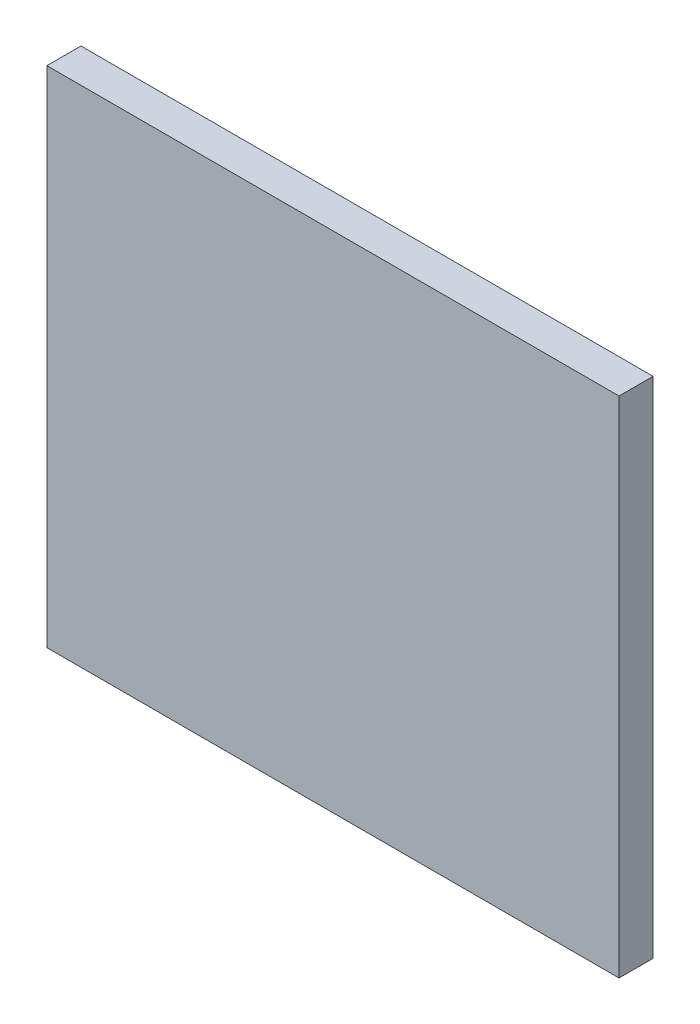
ISO-10303-21;
HEADER;
FILE_DESCRIPTION(('STEP AP214'),'2;1');
FILE_NAME('part.step','',(''),(''),'','','');
FILE_SCHEMA(('AUTOMOTIVE_DESIGN { 1 0 10303 214 1 1 1 1 }'));
ENDSEC;
DATA;
#1=APPLICATION_CONTEXT('core data for automotive mechanical design processes');
#2=APPLICATION_PROTOCOL_DEFINITION('international standard','automotive_design',2000,#1);
#3=PRODUCT_CONTEXT('',#1,'mechanical');
#4=PRODUCT('Part','Part','',(#3));
#5=PRODUCT_RELATED_PRODUCT_CATEGORY('part','',(#4));
#6=PRODUCT_DEFINITION_FORMATION('','',#4);
#7=PRODUCT_DEFINITION_CONTEXT('part definition',#1,'design');
#8=PRODUCT_DEFINITION('design','',#6,#7);
#9=PRODUCT_DEFINITION_SHAPE('','',#8);
#10=(LENGTH_UNIT() NAMED_UNIT(*) SI_UNIT(.MILLI.,.METRE.));
#11=(NAMED_UNIT(*) PLANE_ANGLE_UNIT() SI_UNIT($,.RADIAN.));
#12=(NAMED_UNIT(*) SI_UNIT($,.STERADIAN.) SOLID_ANGLE_UNIT());
#13=UNCERTAINTY_MEASURE_WITH_UNIT(LENGTH_MEASURE(1.E-05),#10,'distance_accuracy_value','');
#14=(GEOMETRIC_REPRESENTATION_CONTEXT(3) GLOBAL_UNCERTAINTY_ASSIGNED_CONTEXT((#13)) GLOBAL_UNIT_ASSIGNED_CONTEXT((#10,
#11,#12)) REPRESENTATION_CONTEXT('',''));
#15=CARTESIAN_POINT('',(0.,0.,0.));
#16=DIRECTION('',(0.,0.,1.));
#17=DIRECTION('',(1.,0.,0.));
#18=AXIS2_PLACEMENT_3D('',#15,#16,#17);
#19=CARTESIAN_POINT('',(-184.540740740741,150.888888888889,5.));
#20=DIRECTION('',(1.,0.,0.));
#21=DIRECTION('',(0.,0.,-1.));
#22=AXIS2_PLACEMENT_3D('',#19,#20,#21);
#23=PLANE('',#22);
#24=DIRECTION('',(0.,-1.,0.));
#25=VECTOR('',#24,1.);
#26=CARTESIAN_POINT('',(-184.540740740741,150.888888888889,0.));
#27=LINE('',#26,#25);
#28=CARTESIAN_POINT('',(-184.540740740741,150.888888888889,0.));
#29=VERTEX_POINT('',#28);
#30=CARTESIAN_POINT('',(-184.540740740741,76.8888888888889,0.));
#31=VERTEX_POINT('',#30);
#32=EDGE_CURVE('E102',#29,#31,#27,.T.);
#33=ORIENTED_EDGE('',*,*,#32,.T.);
#34=DIRECTION('',(0.,0.,-1.));
#35=VECTOR('',#34,1.);
#36=CARTESIAN_POINT('',(-184.540740740741,76.8888888888889,5.));
#37=LINE('',#36,#35);
#38=CARTESIAN_POINT('',(-184.540740740741,76.8888888888889,5.));
#39=VERTEX_POINT('',#38);
#40=EDGE_CURVE('E11',#39,#31,#37,.T.);
#41=ORIENTED_EDGE('',*,*,#40,.F.);
#42=DIRECTION('',(0.,-1.,0.));
#43=VECTOR('',#42,1.);
#44=CARTESIAN_POINT('',(-184.540740740741,150.888888888889,5.));
#45=LINE('',#44,#43);
#46=CARTESIAN_POINT('',(-184.540740740741,150.888888888889,5.));
#47=VERTEX_POINT('',#46);
#48=EDGE_CURVE('E90',#47,#39,#45,.T.);
#49=ORIENTED_EDGE('',*,*,#48,.F.);
#50=DIRECTION('',(0.,0.,-1.));
#51=VECTOR('',#50,1.);
#52=CARTESIAN_POINT('',(-184.540740740741,150.888888888889,5.));
#53=LINE('',#52,#51);
#54=EDGE_CURVE('E98',#47,#29,#53,.T.);
#55=ORIENTED_EDGE('',*,*,#54,.T.);
#56=EDGE_LOOP('',(#33,#41,#49,#55));
#57=FACE_BOUND('',#56,.T.);
#58=ADVANCED_FACE('F39',(#57),#23,.F.);
#59=CARTESIAN_POINT('',(-184.540740740741,76.8888888888889,5.));
#60=DIRECTION('',(0.,1.,0.));
#61=DIRECTION('',(0.,0.,1.));
#62=AXIS2_PLACEMENT_3D('',#59,#60,#61);
#63=PLANE('',#62);
#64=DIRECTION('',(1.,0.,0.));
#65=VECTOR('',#64,1.);
#66=CARTESIAN_POINT('',(-184.540740740741,76.8888888888889,0.));
#67=LINE('',#66,#65);
#68=CARTESIAN_POINT('',(-100.540740740741,76.8888888888889,0.));
#69=VERTEX_POINT('',#68);
#70=EDGE_CURVE('E94',#31,#69,#67,.T.);
#71=ORIENTED_EDGE('',*,*,#70,.T.);
#72=DIRECTION('',(0.,0.,-1.));
#73=VECTOR('',#72,1.);
#74=CARTESIAN_POINT('',(-100.540740740741,76.8888888888889,5.));
#75=LINE('',#74,#73);
#76=CARTESIAN_POINT('',(-100.540740740741,76.8888888888889,5.));
#77=VERTEX_POINT('',#76);
#78=EDGE_CURVE('E47',#77,#69,#75,.T.);
#79=ORIENTED_EDGE('',*,*,#78,.F.);
#80=DIRECTION('',(1.,0.,0.));
#81=VECTOR('',#80,1.);
#82=CARTESIAN_POINT('',(-184.540740740741,76.8888888888889,5.));
#83=LINE('',#82,#81);
#84=EDGE_CURVE('E85',#39,#77,#83,.T.);
#85=ORIENTED_EDGE('',*,*,#84,.F.);
#86=ORIENTED_EDGE('',*,*,#40,.T.);
#87=EDGE_LOOP('',(#71,#79,#85,#86));
#88=FACE_BOUND('',#87,.T.);
#89=ADVANCED_FACE('F93',(#88),#63,.F.);
#90=CARTESIAN_POINT('',(-100.540740740741,150.888888888889,5.));
#91=DIRECTION('',(-1.,0.,0.));
#92=DIRECTION('',(0.,-1.,0.));
#93=AXIS2_PLACEMENT_3D('',#90,#91,#92);
#94=PLANE('',#93);
#95=DIRECTION('',(0.,1.,0.));
#96=VECTOR('',#95,1.);
#97=CARTESIAN_POINT('',(-100.540740740741,150.888888888889,0.));
#98=LINE('',#97,#96);
#99=CARTESIAN_POINT('',(-100.540740740741,150.888888888889,0.));
#100=VERTEX_POINT('',#99);
#101=EDGE_CURVE('E72',#69,#100,#98,.T.);
#102=ORIENTED_EDGE('',*,*,#101,.T.);
#103=DIRECTION('',(0.,0.,-1.));
#104=VECTOR('',#103,1.);
#105=CARTESIAN_POINT('',(-100.540740740741,150.888888888889,5.));
#106=LINE('',#105,#104);
#107=CARTESIAN_POINT('',(-100.540740740741,150.888888888889,5.));
#108=VERTEX_POINT('',#107);
#109=EDGE_CURVE('E95',#108,#100,#106,.T.);
#110=ORIENTED_EDGE('',*,*,#109,.F.);
#111=DIRECTION('',(0.,1.,0.));
#112=VECTOR('',#111,1.);
#113=CARTESIAN_POINT('',(-100.540740740741,150.888888888889,5.));
#114=LINE('',#113,#112);
#115=EDGE_CURVE('E88',#77,#108,#114,.T.);
#116=ORIENTED_EDGE('',*,*,#115,.F.);
#117=ORIENTED_EDGE('',*,*,#78,.T.);
#118=EDGE_LOOP('',(#102,#110,#116,#117));
#119=FACE_BOUND('',#118,.T.);
#120=ADVANCED_FACE('F96',(#119),#94,.F.);
#121=CARTESIAN_POINT('',(-184.540740740741,150.888888888889,5.));
#122=DIRECTION('',(0.,-1.,0.));
#123=DIRECTION('',(0.,0.,-1.));
#124=AXIS2_PLACEMENT_3D('',#121,#122,#123);
#125=PLANE('',#124);
#126=DIRECTION('',(-1.,0.,0.));
#127=VECTOR('',#126,1.);
#128=CARTESIAN_POINT('',(-184.540740740741,150.888888888889,0.));
#129=LINE('',#128,#127);
#130=EDGE_CURVE('E78',#100,#29,#129,.T.);
#131=ORIENTED_EDGE('',*,*,#130,.T.);
#132=ORIENTED_EDGE('',*,*,#54,.F.);
#133=DIRECTION('',(-1.,0.,0.));
#134=VECTOR('',#133,1.);
#135=CARTESIAN_POINT('',(-184.540740740741,150.888888888889,5.));
#136=LINE('',#135,#134);
#137=EDGE_CURVE('E55',#108,#47,#136,.T.);
#138=ORIENTED_EDGE('',*,*,#137,.F.);
#139=ORIENTED_EDGE('',*,*,#109,.T.);
#140=EDGE_LOOP('',(#131,#132,#138,#139));
#141=FACE_BOUND('',#140,.T.);
#142=ADVANCED_FACE('F109',(#141),#125,.F.);
#143=CARTESIAN_POINT('',(0.,0.,5.));
#144=DIRECTION('',(0.,0.,1.));
#145=DIRECTION('',(1.,0.,0.));
#146=AXIS2_PLACEMENT_3D('',#143,#144,#145);
#147=PLANE('',#146);
#148=ORIENTED_EDGE('',*,*,#48,.T.);
#149=ORIENTED_EDGE('',*,*,#84,.T.);
#150=ORIENTED_EDGE('',*,*,#115,.T.);
#151=ORIENTED_EDGE('',*,*,#137,.T.);
#152=EDGE_LOOP('',(#148,#149,#150,#151));
#153=FACE_BOUND('',#152,.T.);
#154=ADVANCED_FACE('F86',(#153),#147,.T.);
#155=CARTESIAN_POINT('',(0.,0.,0.));
#156=DIRECTION('',(0.,0.,1.));
#157=DIRECTION('',(1.,0.,0.));
#158=AXIS2_PLACEMENT_3D('',#155,#156,#157);
#159=PLANE('',#158);
#160=ORIENTED_EDGE('',*,*,#32,.F.);
#161=ORIENTED_EDGE('',*,*,#130,.F.);
#162=ORIENTED_EDGE('',*,*,#101,.F.);
#163=ORIENTED_EDGE('',*,*,#70,.F.);
#164=EDGE_LOOP('',(#160,#161,#162,#163));
#165=FACE_BOUND('',#164,.T.);
#166=ADVANCED_FACE('F112',(#165),#159,.F.);
#167=CLOSED_SHELL('',(#58,#89,#120,#142,#154,#166));
#168=MANIFOLD_SOLID_BREP('B2',#167);
#169=ADVANCED_BREP_SHAPE_REPRESENTATION('',(#18,#168),#14);
#170=SHAPE_DEFINITION_REPRESENTATION(#9,#169);
ENDSEC;
END-ISO-10303-21;
